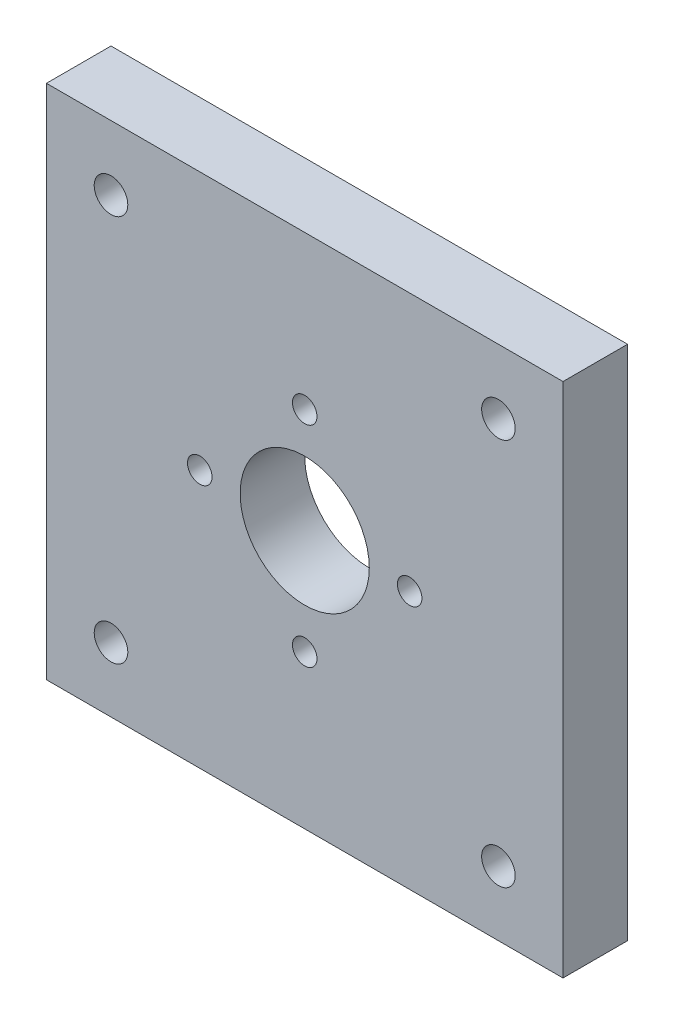
ISO-10303-21;
HEADER;
FILE_DESCRIPTION(('STEP AP214'),'2;1');
FILE_NAME('part.step','',(''),(''),'','','');
FILE_SCHEMA(('AUTOMOTIVE_DESIGN { 1 0 10303 214 1 1 1 1 }'));
ENDSEC;
DATA;
#1=APPLICATION_CONTEXT('core data for automotive mechanical design processes');
#2=APPLICATION_PROTOCOL_DEFINITION('international standard','automotive_design',2000,#1);
#3=PRODUCT_CONTEXT('',#1,'mechanical');
#4=PRODUCT('Part','Part','',(#3));
#5=PRODUCT_RELATED_PRODUCT_CATEGORY('part','',(#4));
#6=PRODUCT_DEFINITION_FORMATION('','',#4);
#7=PRODUCT_DEFINITION_CONTEXT('part definition',#1,'design');
#8=PRODUCT_DEFINITION('design','',#6,#7);
#9=PRODUCT_DEFINITION_SHAPE('','',#8);
#10=(LENGTH_UNIT() NAMED_UNIT(*) SI_UNIT(.MILLI.,.METRE.));
#11=(NAMED_UNIT(*) PLANE_ANGLE_UNIT() SI_UNIT($,.RADIAN.));
#12=(NAMED_UNIT(*) SI_UNIT($,.STERADIAN.) SOLID_ANGLE_UNIT());
#13=UNCERTAINTY_MEASURE_WITH_UNIT(LENGTH_MEASURE(1.E-05),#10,'distance_accuracy_value','');
#14=(GEOMETRIC_REPRESENTATION_CONTEXT(3) GLOBAL_UNCERTAINTY_ASSIGNED_CONTEXT((#13)) GLOBAL_UNIT_ASSIGNED_CONTEXT((#10,
#11,#12)) REPRESENTATION_CONTEXT('',''));
#15=CARTESIAN_POINT('',(0.,0.,0.));
#16=DIRECTION('',(0.,0.,1.));
#17=DIRECTION('',(1.,0.,0.));
#18=AXIS2_PLACEMENT_3D('',#15,#16,#17);
#19=CARTESIAN_POINT('',(0.,0.,0.5));
#20=DIRECTION('',(0.,0.,-1.));
#21=DIRECTION('',(-1.,0.,0.));
#22=AXIS2_PLACEMENT_3D('',#19,#20,#21);
#23=PLANE('',#22);
#24=DIRECTION('',(0.,-1.,0.));
#25=VECTOR('',#24,1.);
#26=CARTESIAN_POINT('',(0.,0.,0.5));
#27=LINE('',#26,#25);
#28=CARTESIAN_POINT('',(0.,4.,0.5));
#29=VERTEX_POINT('',#28);
#30=CARTESIAN_POINT('',(0.,0.,0.5));
#31=VERTEX_POINT('',#30);
#32=EDGE_CURVE('E85',#29,#31,#27,.T.);
#33=ORIENTED_EDGE('',*,*,#32,.T.);
#34=DIRECTION('',(1.,0.,0.));
#35=VECTOR('',#34,1.);
#36=CARTESIAN_POINT('',(0.,0.,0.5));
#37=LINE('',#36,#35);
#38=CARTESIAN_POINT('',(4.,0.,0.5));
#39=VERTEX_POINT('',#38);
#40=EDGE_CURVE('E80',#31,#39,#37,.T.);
#41=ORIENTED_EDGE('',*,*,#40,.T.);
#42=DIRECTION('',(0.,1.,0.));
#43=VECTOR('',#42,1.);
#44=CARTESIAN_POINT('',(4.,0.,0.5));
#45=LINE('',#44,#43);
#46=CARTESIAN_POINT('',(4.,4.,0.5));
#47=VERTEX_POINT('',#46);
#48=EDGE_CURVE('E83',#39,#47,#45,.T.);
#49=ORIENTED_EDGE('',*,*,#48,.T.);
#50=DIRECTION('',(-1.,0.,0.));
#51=VECTOR('',#50,1.);
#52=CARTESIAN_POINT('',(0.,4.,0.5));
#53=LINE('',#52,#51);
#54=EDGE_CURVE('E50',#47,#29,#53,.T.);
#55=ORIENTED_EDGE('',*,*,#54,.T.);
#56=EDGE_LOOP('',(#33,#41,#49,#55));
#57=FACE_BOUND('',#56,.T.);
#58=CARTESIAN_POINT('',(2.,2.,0.5));
#59=DIRECTION('',(0.,0.,1.));
#60=DIRECTION('',(1.,0.,0.));
#61=AXIS2_PLACEMENT_3D('',#58,#59,#60);
#62=CIRCLE('',#61,0.5);
#63=CARTESIAN_POINT('',(2.5,2.,0.5));
#64=VERTEX_POINT('',#63);
#65=EDGE_CURVE('E100',#64,#64,#62,.T.);
#66=ORIENTED_EDGE('',*,*,#65,.F.);
#67=EDGE_LOOP('',(#66));
#68=FACE_BOUND('',#67,.T.);
#69=CARTESIAN_POINT('',(2.,2.8125,0.5));
#70=DIRECTION('',(0.,0.,1.));
#71=DIRECTION('',(1.,0.,0.));
#72=AXIS2_PLACEMENT_3D('',#69,#70,#71);
#73=CIRCLE('',#72,0.0949999999999998);
#74=CARTESIAN_POINT('',(2.095,2.8125,0.5));
#75=VERTEX_POINT('',#74);
#76=EDGE_CURVE('E115',#75,#75,#73,.T.);
#77=ORIENTED_EDGE('',*,*,#76,.F.);
#78=EDGE_LOOP('',(#77));
#79=FACE_BOUND('',#78,.T.);
#80=CARTESIAN_POINT('',(0.5,3.5,0.5));
#81=DIRECTION('',(0.,0.,1.));
#82=DIRECTION('',(1.,0.,0.));
#83=AXIS2_PLACEMENT_3D('',#80,#81,#82);
#84=CIRCLE('',#83,0.13);
#85=CARTESIAN_POINT('',(0.63,3.5,0.5));
#86=VERTEX_POINT('',#85);
#87=EDGE_CURVE('E121',#86,#86,#84,.T.);
#88=ORIENTED_EDGE('',*,*,#87,.F.);
#89=EDGE_LOOP('',(#88));
#90=FACE_BOUND('',#89,.T.);
#91=CARTESIAN_POINT('',(3.5,3.5,0.5));
#92=DIRECTION('',(0.,0.,1.));
#93=DIRECTION('',(1.,0.,0.));
#94=AXIS2_PLACEMENT_3D('',#91,#92,#93);
#95=CIRCLE('',#94,0.13);
#96=CARTESIAN_POINT('',(3.63,3.5,0.5));
#97=VERTEX_POINT('',#96);
#98=EDGE_CURVE('E127',#97,#97,#95,.T.);
#99=ORIENTED_EDGE('',*,*,#98,.F.);
#100=EDGE_LOOP('',(#99));
#101=FACE_BOUND('',#100,.T.);
#102=CARTESIAN_POINT('',(3.5,0.5,0.5));
#103=DIRECTION('',(0.,0.,1.));
#104=DIRECTION('',(-1.,0.,0.));
#105=AXIS2_PLACEMENT_3D('',#102,#103,#104);
#106=CIRCLE('',#105,0.13);
#107=CARTESIAN_POINT('',(3.37,0.5,0.5));
#108=VERTEX_POINT('',#107);
#109=EDGE_CURVE('E133',#108,#108,#106,.T.);
#110=ORIENTED_EDGE('',*,*,#109,.F.);
#111=EDGE_LOOP('',(#110));
#112=FACE_BOUND('',#111,.T.);
#113=CARTESIAN_POINT('',(2.81250000000001,2.00000000000001,0.5));
#114=DIRECTION('',(0.,0.,1.));
#115=DIRECTION('',(1.,0.,0.));
#116=AXIS2_PLACEMENT_3D('',#113,#114,#115);
#117=CIRCLE('',#116,0.0949999999999997);
#118=CARTESIAN_POINT('',(2.90750000000001,2.00000000000001,0.5));
#119=VERTEX_POINT('',#118);
#120=EDGE_CURVE('E139',#119,#119,#117,.T.);
#121=ORIENTED_EDGE('',*,*,#120,.F.);
#122=EDGE_LOOP('',(#121));
#123=FACE_BOUND('',#122,.T.);
#124=CARTESIAN_POINT('',(2.00000000000002,1.1875,0.5));
#125=DIRECTION('',(0.,0.,1.));
#126=DIRECTION('',(1.,0.,0.));
#127=AXIS2_PLACEMENT_3D('',#124,#125,#126);
#128=CIRCLE('',#127,0.0949999999999999);
#129=CARTESIAN_POINT('',(2.09500000000002,1.1875,0.5));
#130=VERTEX_POINT('',#129);
#131=EDGE_CURVE('E145',#130,#130,#128,.T.);
#132=ORIENTED_EDGE('',*,*,#131,.F.);
#133=EDGE_LOOP('',(#132));
#134=FACE_BOUND('',#133,.T.);
#135=CARTESIAN_POINT('',(1.18750000000001,2.,0.5));
#136=DIRECTION('',(0.,0.,1.));
#137=DIRECTION('',(1.,0.,0.));
#138=AXIS2_PLACEMENT_3D('',#135,#136,#137);
#139=CIRCLE('',#138,0.0949999999999999);
#140=CARTESIAN_POINT('',(1.28250000000001,2.,0.5));
#141=VERTEX_POINT('',#140);
#142=EDGE_CURVE('E151',#141,#141,#139,.T.);
#143=ORIENTED_EDGE('',*,*,#142,.F.);
#144=EDGE_LOOP('',(#143));
#145=FACE_BOUND('',#144,.T.);
#146=CARTESIAN_POINT('',(0.5,0.5,0.5));
#147=DIRECTION('',(0.,0.,1.));
#148=DIRECTION('',(-1.,0.,0.));
#149=AXIS2_PLACEMENT_3D('',#146,#147,#148);
#150=CIRCLE('',#149,0.13);
#151=CARTESIAN_POINT('',(0.37,0.5,0.5));
#152=VERTEX_POINT('',#151);
#153=EDGE_CURVE('E157',#152,#152,#150,.T.);
#154=ORIENTED_EDGE('',*,*,#153,.F.);
#155=EDGE_LOOP('',(#154));
#156=FACE_BOUND('',#155,.T.);
#157=ADVANCED_FACE('F33',(#57,#68,#79,#90,#101,#112,#123,#134,#145,#156),#23,.F.);
#158=CARTESIAN_POINT('',(0.,0.,0.));
#159=DIRECTION('',(0.,0.,-1.));
#160=DIRECTION('',(-1.,0.,0.));
#161=AXIS2_PLACEMENT_3D('',#158,#159,#160);
#162=PLANE('',#161);
#163=CARTESIAN_POINT('',(1.18750000000001,2.,0.));
#164=DIRECTION('',(0.,0.,1.));
#165=DIRECTION('',(1.,0.,0.));
#166=AXIS2_PLACEMENT_3D('',#163,#164,#165);
#167=CIRCLE('',#166,0.0949999999999999);
#168=CARTESIAN_POINT('',(1.28250000000001,2.,0.));
#169=VERTEX_POINT('',#168);
#170=EDGE_CURVE('E154',#169,#169,#167,.T.);
#171=ORIENTED_EDGE('',*,*,#170,.T.);
#172=EDGE_LOOP('',(#171));
#173=FACE_BOUND('',#172,.T.);
#174=CARTESIAN_POINT('',(2.81250000000001,2.00000000000001,0.));
#175=DIRECTION('',(0.,0.,1.));
#176=DIRECTION('',(1.,0.,0.));
#177=AXIS2_PLACEMENT_3D('',#174,#175,#176);
#178=CIRCLE('',#177,0.0949999999999997);
#179=CARTESIAN_POINT('',(2.90750000000001,2.00000000000001,0.));
#180=VERTEX_POINT('',#179);
#181=EDGE_CURVE('E142',#180,#180,#178,.T.);
#182=ORIENTED_EDGE('',*,*,#181,.T.);
#183=EDGE_LOOP('',(#182));
#184=FACE_BOUND('',#183,.T.);
#185=CARTESIAN_POINT('',(3.5,3.5,0.));
#186=DIRECTION('',(0.,0.,1.));
#187=DIRECTION('',(1.,0.,0.));
#188=AXIS2_PLACEMENT_3D('',#185,#186,#187);
#189=CIRCLE('',#188,0.13);
#190=CARTESIAN_POINT('',(3.63,3.5,0.));
#191=VERTEX_POINT('',#190);
#192=EDGE_CURVE('E130',#191,#191,#189,.T.);
#193=ORIENTED_EDGE('',*,*,#192,.T.);
#194=EDGE_LOOP('',(#193));
#195=FACE_BOUND('',#194,.T.);
#196=CARTESIAN_POINT('',(2.,2.8125,0.));
#197=DIRECTION('',(0.,0.,1.));
#198=DIRECTION('',(1.,0.,0.));
#199=AXIS2_PLACEMENT_3D('',#196,#197,#198);
#200=CIRCLE('',#199,0.0949999999999998);
#201=CARTESIAN_POINT('',(2.095,2.8125,0.));
#202=VERTEX_POINT('',#201);
#203=EDGE_CURVE('E118',#202,#202,#200,.T.);
#204=ORIENTED_EDGE('',*,*,#203,.T.);
#205=EDGE_LOOP('',(#204));
#206=FACE_BOUND('',#205,.T.);
#207=DIRECTION('',(0.,-1.,0.));
#208=VECTOR('',#207,1.);
#209=CARTESIAN_POINT('',(0.,0.,0.));
#210=LINE('',#209,#208);
#211=CARTESIAN_POINT('',(0.,4.,0.));
#212=VERTEX_POINT('',#211);
#213=CARTESIAN_POINT('',(0.,0.,0.));
#214=VERTEX_POINT('',#213);
#215=EDGE_CURVE('E97',#212,#214,#210,.T.);
#216=ORIENTED_EDGE('',*,*,#215,.F.);
#217=DIRECTION('',(-1.,0.,0.));
#218=VECTOR('',#217,1.);
#219=CARTESIAN_POINT('',(0.,4.,0.));
#220=LINE('',#219,#218);
#221=CARTESIAN_POINT('',(4.,4.,0.));
#222=VERTEX_POINT('',#221);
#223=EDGE_CURVE('E73',#222,#212,#220,.T.);
#224=ORIENTED_EDGE('',*,*,#223,.F.);
#225=DIRECTION('',(0.,1.,0.));
#226=VECTOR('',#225,1.);
#227=CARTESIAN_POINT('',(4.,0.,0.));
#228=LINE('',#227,#226);
#229=CARTESIAN_POINT('',(4.,0.,0.));
#230=VERTEX_POINT('',#229);
#231=EDGE_CURVE('E67',#230,#222,#228,.T.);
#232=ORIENTED_EDGE('',*,*,#231,.F.);
#233=DIRECTION('',(1.,0.,0.));
#234=VECTOR('',#233,1.);
#235=CARTESIAN_POINT('',(0.,0.,0.));
#236=LINE('',#235,#234);
#237=EDGE_CURVE('E89',#214,#230,#236,.T.);
#238=ORIENTED_EDGE('',*,*,#237,.F.);
#239=EDGE_LOOP('',(#216,#224,#232,#238));
#240=FACE_BOUND('',#239,.T.);
#241=CARTESIAN_POINT('',(2.,2.,0.));
#242=DIRECTION('',(0.,0.,1.));
#243=DIRECTION('',(1.,0.,0.));
#244=AXIS2_PLACEMENT_3D('',#241,#242,#243);
#245=CIRCLE('',#244,0.5);
#246=CARTESIAN_POINT('',(2.5,2.,0.));
#247=VERTEX_POINT('',#246);
#248=EDGE_CURVE('E112',#247,#247,#245,.T.);
#249=ORIENTED_EDGE('',*,*,#248,.T.);
#250=EDGE_LOOP('',(#249));
#251=FACE_BOUND('',#250,.T.);
#252=CARTESIAN_POINT('',(0.5,3.5,0.));
#253=DIRECTION('',(0.,0.,1.));
#254=DIRECTION('',(1.,0.,0.));
#255=AXIS2_PLACEMENT_3D('',#252,#253,#254);
#256=CIRCLE('',#255,0.13);
#257=CARTESIAN_POINT('',(0.63,3.5,0.));
#258=VERTEX_POINT('',#257);
#259=EDGE_CURVE('E124',#258,#258,#256,.T.);
#260=ORIENTED_EDGE('',*,*,#259,.T.);
#261=EDGE_LOOP('',(#260));
#262=FACE_BOUND('',#261,.T.);
#263=CARTESIAN_POINT('',(3.5,0.5,0.));
#264=DIRECTION('',(0.,0.,1.));
#265=DIRECTION('',(-1.,0.,0.));
#266=AXIS2_PLACEMENT_3D('',#263,#264,#265);
#267=CIRCLE('',#266,0.13);
#268=CARTESIAN_POINT('',(3.37,0.5,0.));
#269=VERTEX_POINT('',#268);
#270=EDGE_CURVE('E136',#269,#269,#267,.T.);
#271=ORIENTED_EDGE('',*,*,#270,.T.);
#272=EDGE_LOOP('',(#271));
#273=FACE_BOUND('',#272,.T.);
#274=CARTESIAN_POINT('',(2.00000000000002,1.1875,0.));
#275=DIRECTION('',(0.,0.,1.));
#276=DIRECTION('',(1.,0.,0.));
#277=AXIS2_PLACEMENT_3D('',#274,#275,#276);
#278=CIRCLE('',#277,0.0949999999999999);
#279=CARTESIAN_POINT('',(2.09500000000002,1.1875,0.));
#280=VERTEX_POINT('',#279);
#281=EDGE_CURVE('E148',#280,#280,#278,.T.);
#282=ORIENTED_EDGE('',*,*,#281,.T.);
#283=EDGE_LOOP('',(#282));
#284=FACE_BOUND('',#283,.T.);
#285=CARTESIAN_POINT('',(0.5,0.5,0.));
#286=DIRECTION('',(0.,0.,1.));
#287=DIRECTION('',(-1.,0.,0.));
#288=AXIS2_PLACEMENT_3D('',#285,#286,#287);
#289=CIRCLE('',#288,0.13);
#290=CARTESIAN_POINT('',(0.37,0.5,0.));
#291=VERTEX_POINT('',#290);
#292=EDGE_CURVE('E160',#291,#291,#289,.T.);
#293=ORIENTED_EDGE('',*,*,#292,.T.);
#294=EDGE_LOOP('',(#293));
#295=FACE_BOUND('',#294,.T.);
#296=ADVANCED_FACE('F108',(#173,#184,#195,#206,#240,#251,#262,#273,#284,#295),#162,.T.);
#297=CARTESIAN_POINT('',(0.,0.,0.5));
#298=DIRECTION('',(1.,0.,0.));
#299=DIRECTION('',(0.,0.,-1.));
#300=AXIS2_PLACEMENT_3D('',#297,#298,#299);
#301=PLANE('',#300);
#302=ORIENTED_EDGE('',*,*,#215,.T.);
#303=DIRECTION('',(0.,0.,-1.));
#304=VECTOR('',#303,1.);
#305=CARTESIAN_POINT('',(0.,0.,0.5));
#306=LINE('',#305,#304);
#307=EDGE_CURVE('E11',#31,#214,#306,.T.);
#308=ORIENTED_EDGE('',*,*,#307,.F.);
#309=ORIENTED_EDGE('',*,*,#32,.F.);
#310=DIRECTION('',(0.,0.,-1.));
#311=VECTOR('',#310,1.);
#312=CARTESIAN_POINT('',(0.,4.,0.5));
#313=LINE('',#312,#311);
#314=EDGE_CURVE('E93',#29,#212,#313,.T.);
#315=ORIENTED_EDGE('',*,*,#314,.T.);
#316=EDGE_LOOP('',(#302,#308,#309,#315));
#317=FACE_BOUND('',#316,.T.);
#318=ADVANCED_FACE('F35',(#317),#301,.F.);
#319=CARTESIAN_POINT('',(0.,0.,0.5));
#320=DIRECTION('',(0.,1.,0.));
#321=DIRECTION('',(0.,0.,1.));
#322=AXIS2_PLACEMENT_3D('',#319,#320,#321);
#323=PLANE('',#322);
#324=ORIENTED_EDGE('',*,*,#237,.T.);
#325=DIRECTION('',(0.,0.,-1.));
#326=VECTOR('',#325,1.);
#327=CARTESIAN_POINT('',(4.,0.,0.5));
#328=LINE('',#327,#326);
#329=EDGE_CURVE('E42',#39,#230,#328,.T.);
#330=ORIENTED_EDGE('',*,*,#329,.F.);
#331=ORIENTED_EDGE('',*,*,#40,.F.);
#332=ORIENTED_EDGE('',*,*,#307,.T.);
#333=EDGE_LOOP('',(#324,#330,#331,#332));
#334=FACE_BOUND('',#333,.T.);
#335=ADVANCED_FACE('F88',(#334),#323,.F.);
#336=CARTESIAN_POINT('',(4.,0.,0.5));
#337=DIRECTION('',(-1.,0.,0.));
#338=DIRECTION('',(0.,0.,1.));
#339=AXIS2_PLACEMENT_3D('',#336,#337,#338);
#340=PLANE('',#339);
#341=ORIENTED_EDGE('',*,*,#231,.T.);
#342=DIRECTION('',(0.,0.,-1.));
#343=VECTOR('',#342,1.);
#344=CARTESIAN_POINT('',(4.,4.,0.5));
#345=LINE('',#344,#343);
#346=EDGE_CURVE('E90',#47,#222,#345,.T.);
#347=ORIENTED_EDGE('',*,*,#346,.F.);
#348=ORIENTED_EDGE('',*,*,#48,.F.);
#349=ORIENTED_EDGE('',*,*,#329,.T.);
#350=EDGE_LOOP('',(#341,#347,#348,#349));
#351=FACE_BOUND('',#350,.T.);
#352=ADVANCED_FACE('F91',(#351),#340,.F.);
#353=CARTESIAN_POINT('',(0.,4.,0.5));
#354=DIRECTION('',(0.,-1.,0.));
#355=DIRECTION('',(0.,0.,-1.));
#356=AXIS2_PLACEMENT_3D('',#353,#354,#355);
#357=PLANE('',#356);
#358=ORIENTED_EDGE('',*,*,#223,.T.);
#359=ORIENTED_EDGE('',*,*,#314,.F.);
#360=ORIENTED_EDGE('',*,*,#54,.F.);
#361=ORIENTED_EDGE('',*,*,#346,.T.);
#362=EDGE_LOOP('',(#358,#359,#360,#361));
#363=FACE_BOUND('',#362,.T.);
#364=ADVANCED_FACE('F105',(#363),#357,.F.);
#365=CARTESIAN_POINT('',(2.,2.,0.5));
#366=DIRECTION('',(0.,0.,-1.));
#367=DIRECTION('',(-1.,0.,0.));
#368=AXIS2_PLACEMENT_3D('',#365,#366,#367);
#369=CYLINDRICAL_SURFACE('',#368,0.5);
#370=ORIENTED_EDGE('',*,*,#65,.T.);
#371=EDGE_LOOP('',(#370));
#372=FACE_BOUND('',#371,.T.);
#373=ORIENTED_EDGE('',*,*,#248,.F.);
#374=EDGE_LOOP('',(#373));
#375=FACE_BOUND('',#374,.T.);
#376=ADVANCED_FACE('F177',(#372,#375),#369,.F.);
#377=CARTESIAN_POINT('',(2.,2.8125,0.5));
#378=DIRECTION('',(0.,0.,-1.));
#379=DIRECTION('',(-1.,0.,0.));
#380=AXIS2_PLACEMENT_3D('',#377,#378,#379);
#381=CYLINDRICAL_SURFACE('',#380,0.0949999999999998);
#382=ORIENTED_EDGE('',*,*,#76,.T.);
#383=EDGE_LOOP('',(#382));
#384=FACE_BOUND('',#383,.T.);
#385=ORIENTED_EDGE('',*,*,#203,.F.);
#386=EDGE_LOOP('',(#385));
#387=FACE_BOUND('',#386,.T.);
#388=ADVANCED_FACE('F223',(#384,#387),#381,.F.);
#389=CARTESIAN_POINT('',(0.5,3.5,0.5));
#390=DIRECTION('',(0.,0.,-1.));
#391=DIRECTION('',(-1.,0.,0.));
#392=AXIS2_PLACEMENT_3D('',#389,#390,#391);
#393=CYLINDRICAL_SURFACE('',#392,0.13);
#394=ORIENTED_EDGE('',*,*,#87,.T.);
#395=EDGE_LOOP('',(#394));
#396=FACE_BOUND('',#395,.T.);
#397=ORIENTED_EDGE('',*,*,#259,.F.);
#398=EDGE_LOOP('',(#397));
#399=FACE_BOUND('',#398,.T.);
#400=ADVANCED_FACE('F231',(#396,#399),#393,.F.);
#401=CARTESIAN_POINT('',(3.5,3.5,0.5));
#402=DIRECTION('',(0.,0.,-1.));
#403=DIRECTION('',(-1.,0.,0.));
#404=AXIS2_PLACEMENT_3D('',#401,#402,#403);
#405=CYLINDRICAL_SURFACE('',#404,0.13);
#406=ORIENTED_EDGE('',*,*,#98,.T.);
#407=EDGE_LOOP('',(#406));
#408=FACE_BOUND('',#407,.T.);
#409=ORIENTED_EDGE('',*,*,#192,.F.);
#410=EDGE_LOOP('',(#409));
#411=FACE_BOUND('',#410,.T.);
#412=ADVANCED_FACE('F239',(#408,#411),#405,.F.);
#413=CARTESIAN_POINT('',(3.5,0.5,0.5));
#414=DIRECTION('',(0.,0.,-1.));
#415=DIRECTION('',(-1.,0.,0.));
#416=AXIS2_PLACEMENT_3D('',#413,#414,#415);
#417=CYLINDRICAL_SURFACE('',#416,0.13);
#418=ORIENTED_EDGE('',*,*,#109,.T.);
#419=EDGE_LOOP('',(#418));
#420=FACE_BOUND('',#419,.T.);
#421=ORIENTED_EDGE('',*,*,#270,.F.);
#422=EDGE_LOOP('',(#421));
#423=FACE_BOUND('',#422,.T.);
#424=ADVANCED_FACE('F248',(#420,#423),#417,.F.);
#425=CARTESIAN_POINT('',(2.81250000000001,2.00000000000001,0.5));
#426=DIRECTION('',(0.,0.,-1.));
#427=DIRECTION('',(-1.,0.,0.));
#428=AXIS2_PLACEMENT_3D('',#425,#426,#427);
#429=CYLINDRICAL_SURFACE('',#428,0.0949999999999997);
#430=ORIENTED_EDGE('',*,*,#120,.T.);
#431=EDGE_LOOP('',(#430));
#432=FACE_BOUND('',#431,.T.);
#433=ORIENTED_EDGE('',*,*,#181,.F.);
#434=EDGE_LOOP('',(#433));
#435=FACE_BOUND('',#434,.T.);
#436=ADVANCED_FACE('F257',(#432,#435),#429,.F.);
#437=CARTESIAN_POINT('',(2.00000000000002,1.1875,0.5));
#438=DIRECTION('',(0.,0.,-1.));
#439=DIRECTION('',(-1.,0.,0.));
#440=AXIS2_PLACEMENT_3D('',#437,#438,#439);
#441=CYLINDRICAL_SURFACE('',#440,0.0949999999999999);
#442=ORIENTED_EDGE('',*,*,#131,.T.);
#443=EDGE_LOOP('',(#442));
#444=FACE_BOUND('',#443,.T.);
#445=ORIENTED_EDGE('',*,*,#281,.F.);
#446=EDGE_LOOP('',(#445));
#447=FACE_BOUND('',#446,.T.);
#448=ADVANCED_FACE('F266',(#444,#447),#441,.F.);
#449=CARTESIAN_POINT('',(1.18750000000001,2.,0.5));
#450=DIRECTION('',(0.,0.,-1.));
#451=DIRECTION('',(-1.,0.,0.));
#452=AXIS2_PLACEMENT_3D('',#449,#450,#451);
#453=CYLINDRICAL_SURFACE('',#452,0.0949999999999999);
#454=ORIENTED_EDGE('',*,*,#142,.T.);
#455=EDGE_LOOP('',(#454));
#456=FACE_BOUND('',#455,.T.);
#457=ORIENTED_EDGE('',*,*,#170,.F.);
#458=EDGE_LOOP('',(#457));
#459=FACE_BOUND('',#458,.T.);
#460=ADVANCED_FACE('F275',(#456,#459),#453,.F.);
#461=CARTESIAN_POINT('',(0.5,0.5,0.5));
#462=DIRECTION('',(0.,0.,-1.));
#463=DIRECTION('',(-1.,0.,0.));
#464=AXIS2_PLACEMENT_3D('',#461,#462,#463);
#465=CYLINDRICAL_SURFACE('',#464,0.13);
#466=ORIENTED_EDGE('',*,*,#153,.T.);
#467=EDGE_LOOP('',(#466));
#468=FACE_BOUND('',#467,.T.);
#469=ORIENTED_EDGE('',*,*,#292,.F.);
#470=EDGE_LOOP('',(#469));
#471=FACE_BOUND('',#470,.T.);
#472=ADVANCED_FACE('F166',(#468,#471),#465,.F.);
#473=CLOSED_SHELL('',(#157,#296,#318,#335,#352,#364,#376,#388,#400,#412,#424,#436,#448,#460,#472));
#474=MANIFOLD_SOLID_BREP('B2',#473);
#475=ADVANCED_BREP_SHAPE_REPRESENTATION('',(#18,#474),#14);
#476=SHAPE_DEFINITION_REPRESENTATION(#9,#475);
ENDSEC;
END-ISO-10303-21;
